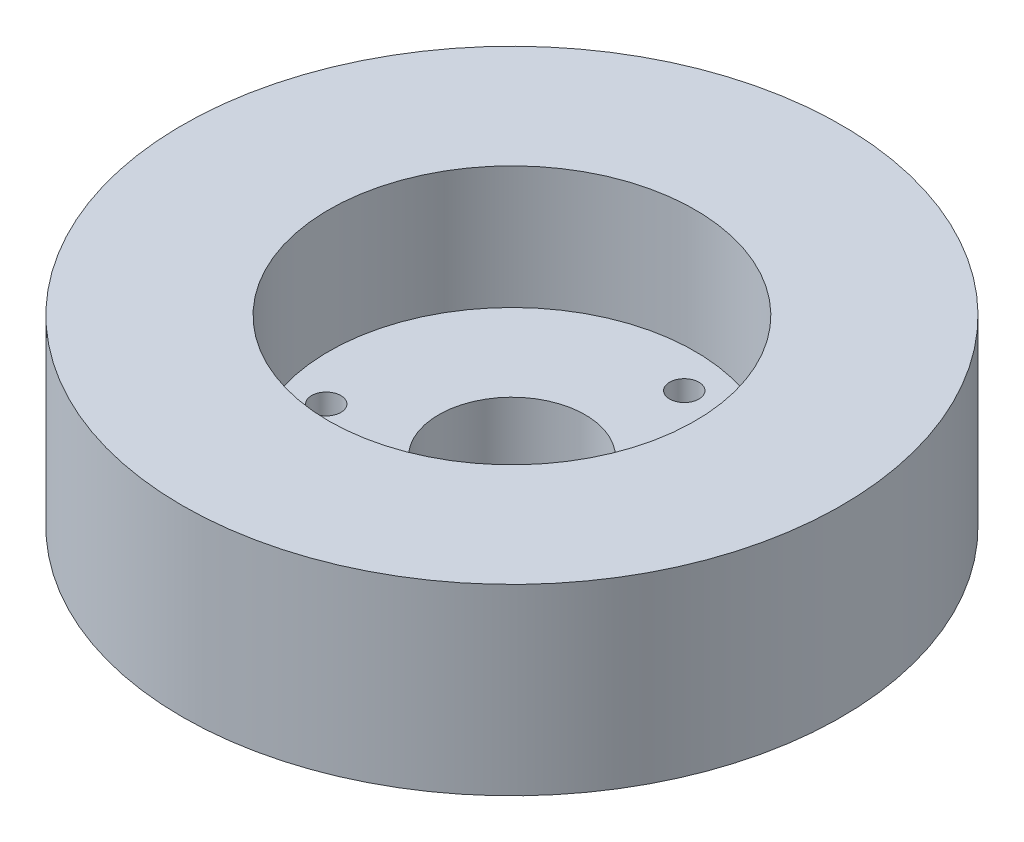
ISO-10303-21;
HEADER;
FILE_DESCRIPTION(('STEP AP214'),'2;1');
FILE_NAME('part.step','',(''),(''),'','','');
FILE_SCHEMA(('AUTOMOTIVE_DESIGN { 1 0 10303 214 1 1 1 1 }'));
ENDSEC;
DATA;
#1=APPLICATION_CONTEXT('core data for automotive mechanical design processes');
#2=APPLICATION_PROTOCOL_DEFINITION('international standard','automotive_design',2000,#1);
#3=PRODUCT_CONTEXT('',#1,'mechanical');
#4=PRODUCT('Part','Part','',(#3));
#5=PRODUCT_RELATED_PRODUCT_CATEGORY('part','',(#4));
#6=PRODUCT_DEFINITION_FORMATION('','',#4);
#7=PRODUCT_DEFINITION_CONTEXT('part definition',#1,'design');
#8=PRODUCT_DEFINITION('design','',#6,#7);
#9=PRODUCT_DEFINITION_SHAPE('','',#8);
#10=(LENGTH_UNIT() NAMED_UNIT(*) SI_UNIT(.MILLI.,.METRE.));
#11=(NAMED_UNIT(*) PLANE_ANGLE_UNIT() SI_UNIT($,.RADIAN.));
#12=(NAMED_UNIT(*) SI_UNIT($,.STERADIAN.) SOLID_ANGLE_UNIT());
#13=UNCERTAINTY_MEASURE_WITH_UNIT(LENGTH_MEASURE(1.E-05),#10,'distance_accuracy_value','');
#14=(GEOMETRIC_REPRESENTATION_CONTEXT(3) GLOBAL_UNCERTAINTY_ASSIGNED_CONTEXT((#13)) GLOBAL_UNIT_ASSIGNED_CONTEXT((#10,
#11,#12)) REPRESENTATION_CONTEXT('',''));
#15=CARTESIAN_POINT('',(0.,0.,0.));
#16=DIRECTION('',(0.,0.,1.));
#17=DIRECTION('',(1.,0.,0.));
#18=AXIS2_PLACEMENT_3D('',#15,#16,#17);
#19=CARTESIAN_POINT('',(0.,50.,0.));
#20=DIRECTION('',(0.,-1.,0.));
#21=DIRECTION('',(0.,0.,-1.));
#22=AXIS2_PLACEMENT_3D('',#19,#20,#21);
#23=CYLINDRICAL_SURFACE('',#22,90.);
#24=CARTESIAN_POINT('',(0.,50.,0.));
#25=DIRECTION('',(0.,1.,0.));
#26=DIRECTION('',(0.,0.,1.));
#27=AXIS2_PLACEMENT_3D('',#24,#25,#26);
#28=CIRCLE('',#27,90.);
#29=CARTESIAN_POINT('',(0.,50.,90.));
#30=VERTEX_POINT('',#29);
#31=EDGE_CURVE('E10',#30,#30,#28,.T.);
#32=ORIENTED_EDGE('',*,*,#31,.F.);
#33=EDGE_LOOP('',(#32));
#34=FACE_BOUND('',#33,.T.);
#35=CARTESIAN_POINT('',(0.,0.,0.));
#36=DIRECTION('',(0.,1.,0.));
#37=DIRECTION('',(0.,0.,1.));
#38=AXIS2_PLACEMENT_3D('',#35,#36,#37);
#39=CIRCLE('',#38,90.);
#40=CARTESIAN_POINT('',(0.,0.,90.));
#41=VERTEX_POINT('',#40);
#42=EDGE_CURVE('E44',#41,#41,#39,.T.);
#43=ORIENTED_EDGE('',*,*,#42,.T.);
#44=EDGE_LOOP('',(#43));
#45=FACE_BOUND('',#44,.T.);
#46=ADVANCED_FACE('F37',(#34,#45),#23,.T.);
#47=CARTESIAN_POINT('',(0.,50.,0.));
#48=DIRECTION('',(0.,1.,0.));
#49=DIRECTION('',(0.,0.,1.));
#50=AXIS2_PLACEMENT_3D('',#47,#48,#49);
#51=PLANE('',#50);
#52=CARTESIAN_POINT('',(0.,50.,0.));
#53=DIRECTION('',(0.,1.,0.));
#54=DIRECTION('',(0.,0.,1.));
#55=AXIS2_PLACEMENT_3D('',#52,#53,#54);
#56=CIRCLE('',#55,50.);
#57=CARTESIAN_POINT('',(0.,50.,50.));
#58=VERTEX_POINT('',#57);
#59=EDGE_CURVE('E52',#58,#58,#56,.T.);
#60=ORIENTED_EDGE('',*,*,#59,.F.);
#61=EDGE_LOOP('',(#60));
#62=FACE_BOUND('',#61,.T.);
#63=ORIENTED_EDGE('',*,*,#31,.T.);
#64=EDGE_LOOP('',(#63));
#65=FACE_BOUND('',#64,.T.);
#66=ADVANCED_FACE('F84',(#62,#65),#51,.T.);
#67=CARTESIAN_POINT('',(0.,0.,0.));
#68=DIRECTION('',(0.,1.,0.));
#69=DIRECTION('',(0.,0.,1.));
#70=AXIS2_PLACEMENT_3D('',#67,#68,#69);
#71=PLANE('',#70);
#72=CARTESIAN_POINT('',(-37.8891738009388,0.,12.8222661289746));
#73=DIRECTION('',(0.,-1.,0.));
#74=DIRECTION('',(0.,0.,-1.));
#75=AXIS2_PLACEMENT_3D('',#72,#73,#74);
#76=CIRCLE('',#75,4.00000000000025);
#77=CARTESIAN_POINT('',(-37.8891738009388,0.,8.8222661289744));
#78=VERTEX_POINT('',#77);
#79=EDGE_CURVE('E62',#78,#78,#76,.T.);
#80=ORIENTED_EDGE('',*,*,#79,.F.);
#81=EDGE_LOOP('',(#80));
#82=FACE_BOUND('',#81,.T.);
#83=CARTESIAN_POINT('',(7.84017869869047,0.,-39.224120104506));
#84=DIRECTION('',(0.,-1.,0.));
#85=DIRECTION('',(0.,0.,-1.));
#86=AXIS2_PLACEMENT_3D('',#83,#84,#85);
#87=CIRCLE('',#86,4.);
#88=CARTESIAN_POINT('',(7.84017869869047,0.,-43.224120104506));
#89=VERTEX_POINT('',#88);
#90=EDGE_CURVE('E120',#89,#89,#87,.T.);
#91=ORIENTED_EDGE('',*,*,#90,.F.);
#92=EDGE_LOOP('',(#91));
#93=FACE_BOUND('',#92,.T.);
#94=CARTESIAN_POINT('',(30.0489951022468,0.,26.4018539755267));
#95=DIRECTION('',(0.,-1.,0.));
#96=DIRECTION('',(0.,0.,-1.));
#97=AXIS2_PLACEMENT_3D('',#94,#95,#96);
#98=CIRCLE('',#97,4.00000000000042);
#99=CARTESIAN_POINT('',(30.0489951022468,0.,22.4018539755263));
#100=VERTEX_POINT('',#99);
#101=EDGE_CURVE('E74',#100,#100,#98,.T.);
#102=ORIENTED_EDGE('',*,*,#101,.F.);
#103=EDGE_LOOP('',(#102));
#104=FACE_BOUND('',#103,.T.);
#105=CARTESIAN_POINT('',(0.,0.,0.));
#106=DIRECTION('',(0.,1.,0.));
#107=DIRECTION('',(0.,0.,1.));
#108=AXIS2_PLACEMENT_3D('',#105,#106,#107);
#109=CIRCLE('',#108,20.);
#110=CARTESIAN_POINT('',(0.,0.,20.));
#111=VERTEX_POINT('',#110);
#112=EDGE_CURVE('E55',#111,#111,#109,.T.);
#113=ORIENTED_EDGE('',*,*,#112,.T.);
#114=EDGE_LOOP('',(#113));
#115=FACE_BOUND('',#114,.T.);
#116=ORIENTED_EDGE('',*,*,#42,.F.);
#117=EDGE_LOOP('',(#116));
#118=FACE_BOUND('',#117,.T.);
#119=ADVANCED_FACE('F86',(#82,#93,#104,#115,#118),#71,.F.);
#120=CARTESIAN_POINT('',(0.,16.5,0.));
#121=DIRECTION('',(0.,1.,0.));
#122=DIRECTION('',(0.,0.,1.));
#123=AXIS2_PLACEMENT_3D('',#120,#121,#122);
#124=CYLINDRICAL_SURFACE('',#123,50.);
#125=CARTESIAN_POINT('',(0.,16.5,0.));
#126=DIRECTION('',(0.,1.,0.));
#127=DIRECTION('',(0.,0.,1.));
#128=AXIS2_PLACEMENT_3D('',#125,#126,#127);
#129=CIRCLE('',#128,50.);
#130=CARTESIAN_POINT('',(0.,16.5,50.));
#131=VERTEX_POINT('',#130);
#132=EDGE_CURVE('E49',#131,#131,#129,.T.);
#133=ORIENTED_EDGE('',*,*,#132,.F.);
#134=EDGE_LOOP('',(#133));
#135=FACE_BOUND('',#134,.T.);
#136=ORIENTED_EDGE('',*,*,#59,.T.);
#137=EDGE_LOOP('',(#136));
#138=FACE_BOUND('',#137,.T.);
#139=ADVANCED_FACE('F82',(#135,#138),#124,.F.);
#140=CARTESIAN_POINT('',(0.,16.5,0.));
#141=DIRECTION('',(0.,1.,0.));
#142=DIRECTION('',(0.,0.,1.));
#143=AXIS2_PLACEMENT_3D('',#140,#141,#142);
#144=PLANE('',#143);
#145=CARTESIAN_POINT('',(-37.8891738009388,16.5,12.8222661289746));
#146=DIRECTION('',(0.,1.,0.));
#147=DIRECTION('',(0.,0.,1.));
#148=AXIS2_PLACEMENT_3D('',#145,#146,#147);
#149=CIRCLE('',#148,4.00000000000025);
#150=CARTESIAN_POINT('',(-37.8891738009388,16.5,16.8222661289749));
#151=VERTEX_POINT('',#150);
#152=EDGE_CURVE('E40',#151,#151,#149,.T.);
#153=ORIENTED_EDGE('',*,*,#152,.F.);
#154=EDGE_LOOP('',(#153));
#155=FACE_BOUND('',#154,.T.);
#156=CARTESIAN_POINT('',(7.84017869869047,16.5,-39.224120104506));
#157=DIRECTION('',(0.,1.,0.));
#158=DIRECTION('',(0.,0.,1.));
#159=AXIS2_PLACEMENT_3D('',#156,#157,#158);
#160=CIRCLE('',#159,4.);
#161=CARTESIAN_POINT('',(7.84017869869047,16.5,-35.224120104506));
#162=VERTEX_POINT('',#161);
#163=EDGE_CURVE('E61',#162,#162,#160,.T.);
#164=ORIENTED_EDGE('',*,*,#163,.F.);
#165=EDGE_LOOP('',(#164));
#166=FACE_BOUND('',#165,.T.);
#167=CARTESIAN_POINT('',(30.0489951022468,16.5,26.4018539755267));
#168=DIRECTION('',(0.,1.,0.));
#169=DIRECTION('',(0.,0.,1.));
#170=AXIS2_PLACEMENT_3D('',#167,#168,#169);
#171=CIRCLE('',#170,4.00000000000042);
#172=CARTESIAN_POINT('',(30.0489951022468,16.5,30.4018539755271));
#173=VERTEX_POINT('',#172);
#174=EDGE_CURVE('E59',#173,#173,#171,.T.);
#175=ORIENTED_EDGE('',*,*,#174,.F.);
#176=EDGE_LOOP('',(#175));
#177=FACE_BOUND('',#176,.T.);
#178=CARTESIAN_POINT('',(0.,16.5,0.));
#179=DIRECTION('',(0.,1.,0.));
#180=DIRECTION('',(0.,0.,1.));
#181=AXIS2_PLACEMENT_3D('',#178,#179,#180);
#182=CIRCLE('',#181,20.);
#183=CARTESIAN_POINT('',(0.,16.5,20.));
#184=VERTEX_POINT('',#183);
#185=EDGE_CURVE('E58',#184,#184,#182,.T.);
#186=ORIENTED_EDGE('',*,*,#185,.F.);
#187=EDGE_LOOP('',(#186));
#188=FACE_BOUND('',#187,.T.);
#189=ORIENTED_EDGE('',*,*,#132,.T.);
#190=EDGE_LOOP('',(#189));
#191=FACE_BOUND('',#190,.T.);
#192=ADVANCED_FACE('F98',(#155,#166,#177,#188,#191),#144,.T.);
#193=CARTESIAN_POINT('',(0.,-18.5,0.));
#194=DIRECTION('',(0.,1.,0.));
#195=DIRECTION('',(0.,0.,1.));
#196=AXIS2_PLACEMENT_3D('',#193,#194,#195);
#197=CYLINDRICAL_SURFACE('',#196,20.);
#198=ORIENTED_EDGE('',*,*,#185,.T.);
#199=EDGE_LOOP('',(#198));
#200=FACE_BOUND('',#199,.T.);
#201=ORIENTED_EDGE('',*,*,#112,.F.);
#202=EDGE_LOOP('',(#201));
#203=FACE_BOUND('',#202,.T.);
#204=ADVANCED_FACE('F102',(#200,#203),#197,.F.);
#205=CARTESIAN_POINT('',(30.0489951022468,72.,26.4018539755267));
#206=DIRECTION('',(0.,-1.,0.));
#207=DIRECTION('',(0.,0.,-1.));
#208=AXIS2_PLACEMENT_3D('',#205,#206,#207);
#209=CYLINDRICAL_SURFACE('',#208,4.00000000000042);
#210=ORIENTED_EDGE('',*,*,#174,.T.);
#211=EDGE_LOOP('',(#210));
#212=FACE_BOUND('',#211,.T.);
#213=ORIENTED_EDGE('',*,*,#101,.T.);
#214=EDGE_LOOP('',(#213));
#215=FACE_BOUND('',#214,.T.);
#216=ADVANCED_FACE('F106',(#212,#215),#209,.F.);
#217=CARTESIAN_POINT('',(7.84017869869047,72.,-39.224120104506));
#218=DIRECTION('',(0.,-1.,0.));
#219=DIRECTION('',(0.,0.,-1.));
#220=AXIS2_PLACEMENT_3D('',#217,#218,#219);
#221=CYLINDRICAL_SURFACE('',#220,4.);
#222=ORIENTED_EDGE('',*,*,#163,.T.);
#223=EDGE_LOOP('',(#222));
#224=FACE_BOUND('',#223,.T.);
#225=ORIENTED_EDGE('',*,*,#90,.T.);
#226=EDGE_LOOP('',(#225));
#227=FACE_BOUND('',#226,.T.);
#228=ADVANCED_FACE('F109',(#224,#227),#221,.F.);
#229=CARTESIAN_POINT('',(-37.8891738009388,72.,12.8222661289746));
#230=DIRECTION('',(0.,-1.,0.));
#231=DIRECTION('',(0.,0.,-1.));
#232=AXIS2_PLACEMENT_3D('',#229,#230,#231);
#233=CYLINDRICAL_SURFACE('',#232,4.00000000000025);
#234=ORIENTED_EDGE('',*,*,#152,.T.);
#235=EDGE_LOOP('',(#234));
#236=FACE_BOUND('',#235,.T.);
#237=ORIENTED_EDGE('',*,*,#79,.T.);
#238=EDGE_LOOP('',(#237));
#239=FACE_BOUND('',#238,.T.);
#240=ADVANCED_FACE('F113',(#236,#239),#233,.F.);
#241=CLOSED_SHELL('',(#46,#66,#119,#139,#192,#204,#216,#228,#240));
#242=MANIFOLD_SOLID_BREP('B2',#241);
#243=ADVANCED_BREP_SHAPE_REPRESENTATION('',(#18,#242),#14);
#244=SHAPE_DEFINITION_REPRESENTATION(#9,#243);
ENDSEC;
END-ISO-10303-21;
